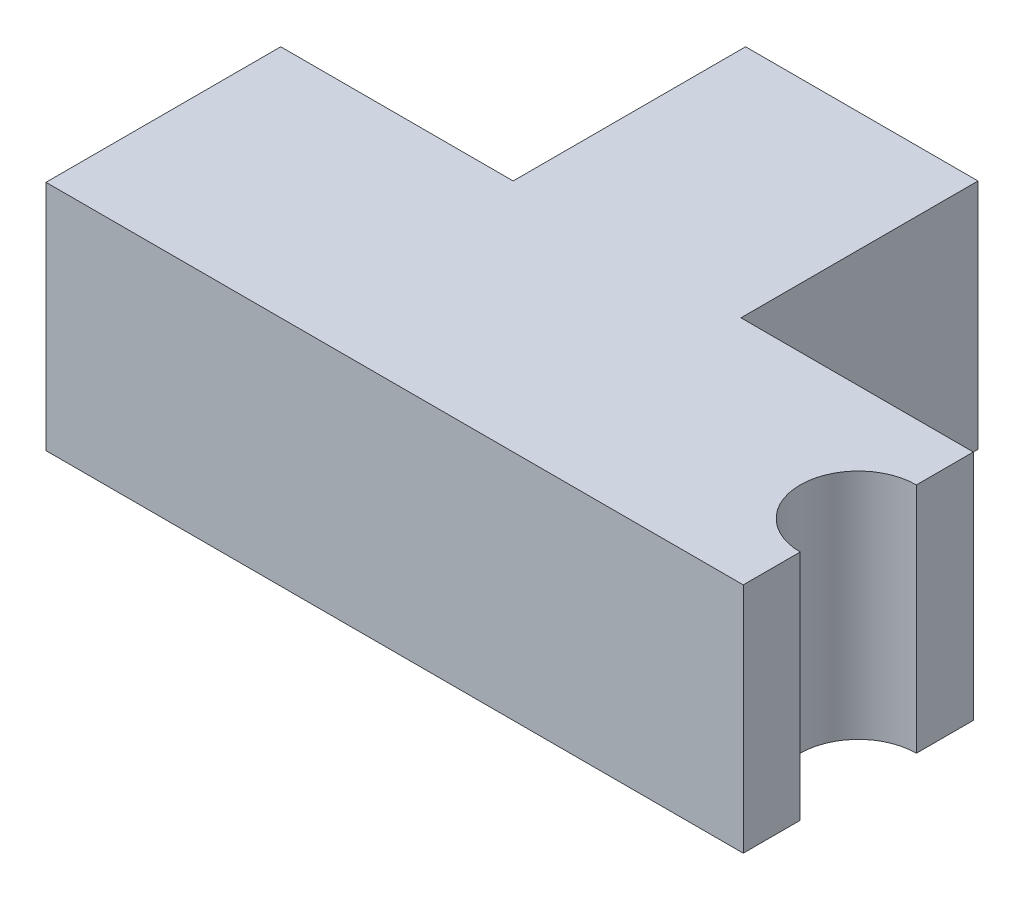
ISO-10303-21;
HEADER;
FILE_DESCRIPTION(('STEP AP214'),'2;1');
FILE_NAME('part.step','',(''),(''),'','','');
FILE_SCHEMA(('AUTOMOTIVE_DESIGN { 1 0 10303 214 1 1 1 1 }'));
ENDSEC;
DATA;
#1=APPLICATION_CONTEXT('core data for automotive mechanical design processes');
#2=APPLICATION_PROTOCOL_DEFINITION('international standard','automotive_design',2000,#1);
#3=PRODUCT_CONTEXT('',#1,'mechanical');
#4=PRODUCT('Part','Part','',(#3));
#5=PRODUCT_RELATED_PRODUCT_CATEGORY('part','',(#4));
#6=PRODUCT_DEFINITION_FORMATION('','',#4);
#7=PRODUCT_DEFINITION_CONTEXT('part definition',#1,'design');
#8=PRODUCT_DEFINITION('design','',#6,#7);
#9=PRODUCT_DEFINITION_SHAPE('','',#8);
#10=(LENGTH_UNIT() NAMED_UNIT(*) SI_UNIT(.MILLI.,.METRE.));
#11=(NAMED_UNIT(*) PLANE_ANGLE_UNIT() SI_UNIT($,.RADIAN.));
#12=(NAMED_UNIT(*) SI_UNIT($,.STERADIAN.) SOLID_ANGLE_UNIT());
#13=UNCERTAINTY_MEASURE_WITH_UNIT(LENGTH_MEASURE(1.E-05),#10,'distance_accuracy_value','');
#14=(GEOMETRIC_REPRESENTATION_CONTEXT(3) GLOBAL_UNCERTAINTY_ASSIGNED_CONTEXT((#13)) GLOBAL_UNIT_ASSIGNED_CONTEXT((#10,
#11,#12)) REPRESENTATION_CONTEXT('',''));
#15=CARTESIAN_POINT('',(0.,0.,0.));
#16=DIRECTION('',(0.,0.,1.));
#17=DIRECTION('',(1.,0.,0.));
#18=AXIS2_PLACEMENT_3D('',#15,#16,#17);
#19=CARTESIAN_POINT('',(14.85,10.,4.9995));
#20=DIRECTION('',(-1.,0.,0.));
#21=DIRECTION('',(0.,0.,1.));
#22=AXIS2_PLACEMENT_3D('',#19,#20,#21);
#23=PLANE('',#22);
#24=DIRECTION('',(0.,0.,-1.));
#25=VECTOR('',#24,1.);
#26=CARTESIAN_POINT('',(14.85,0.,4.9995));
#27=LINE('',#26,#25);
#28=CARTESIAN_POINT('',(14.85,0.,4.9995));
#29=VERTEX_POINT('',#28);
#30=CARTESIAN_POINT('',(14.85,0.,2.5495));
#31=VERTEX_POINT('',#30);
#32=EDGE_CURVE('E141',#29,#31,#27,.T.);
#33=ORIENTED_EDGE('',*,*,#32,.T.);
#34=DIRECTION('',(0.,1.,0.));
#35=VECTOR('',#34,1.);
#36=CARTESIAN_POINT('',(14.85,0.,2.5495));
#37=LINE('',#36,#35);
#38=CARTESIAN_POINT('',(14.85,10.,2.5495));
#39=VERTEX_POINT('',#38);
#40=EDGE_CURVE('E47',#31,#39,#37,.T.);
#41=ORIENTED_EDGE('',*,*,#40,.T.);
#42=DIRECTION('',(0.,0.,-1.));
#43=VECTOR('',#42,1.);
#44=CARTESIAN_POINT('',(14.85,10.,4.9995));
#45=LINE('',#44,#43);
#46=CARTESIAN_POINT('',(14.85,10.,4.9995));
#47=VERTEX_POINT('',#46);
#48=EDGE_CURVE('E200',#47,#39,#45,.T.);
#49=ORIENTED_EDGE('',*,*,#48,.F.);
#50=DIRECTION('',(0.,-1.,0.));
#51=VECTOR('',#50,1.);
#52=CARTESIAN_POINT('',(14.85,10.,4.9995));
#53=LINE('',#52,#51);
#54=EDGE_CURVE('E137',#47,#29,#53,.T.);
#55=ORIENTED_EDGE('',*,*,#54,.T.);
#56=EDGE_LOOP('',(#33,#41,#49,#55));
#57=FACE_BOUND('',#56,.T.);
#58=ADVANCED_FACE('F33',(#57),#23,.F.);
#59=CARTESIAN_POINT('',(14.85,10.,-2.4505));
#60=VERTEX_POINT('',#59);
#61=CARTESIAN_POINT('',(14.85,10.,-4.9005));
#62=VERTEX_POINT('',#61);
#63=EDGE_CURVE('E97',#60,#62,#45,.T.);
#64=ORIENTED_EDGE('',*,*,#63,.F.);
#65=DIRECTION('',(0.,1.,0.));
#66=VECTOR('',#65,1.);
#67=CARTESIAN_POINT('',(14.85,0.,-2.4505));
#68=LINE('',#67,#66);
#69=CARTESIAN_POINT('',(14.85,0.,-2.4505));
#70=VERTEX_POINT('',#69);
#71=EDGE_CURVE('E180',#60,#70,#68,.F.);
#72=ORIENTED_EDGE('',*,*,#71,.T.);
#73=CARTESIAN_POINT('',(14.85,0.,-4.9005));
#74=VERTEX_POINT('',#73);
#75=EDGE_CURVE('E145',#70,#74,#27,.T.);
#76=ORIENTED_EDGE('',*,*,#75,.T.);
#77=DIRECTION('',(0.,-1.,0.));
#78=VECTOR('',#77,1.);
#79=CARTESIAN_POINT('',(14.85,10.,-4.9005));
#80=LINE('',#79,#78);
#81=EDGE_CURVE('E41',#62,#74,#80,.T.);
#82=ORIENTED_EDGE('',*,*,#81,.F.);
#83=EDGE_LOOP('',(#64,#72,#76,#82));
#84=FACE_BOUND('',#83,.T.);
#85=ADVANCED_FACE('F35',(#84),#23,.F.);
#86=CARTESIAN_POINT('',(4.85,10.,-4.9005));
#87=DIRECTION('',(0.,0.,1.));
#88=DIRECTION('',(1.,0.,0.));
#89=AXIS2_PLACEMENT_3D('',#86,#87,#88);
#90=PLANE('',#89);
#91=DIRECTION('',(-1.,0.,0.));
#92=VECTOR('',#91,1.);
#93=CARTESIAN_POINT('',(4.85,0.,-4.9005));
#94=LINE('',#93,#92);
#95=CARTESIAN_POINT('',(4.85,0.,-4.9005));
#96=VERTEX_POINT('',#95);
#97=EDGE_CURVE('E144',#74,#96,#94,.T.);
#98=ORIENTED_EDGE('',*,*,#97,.T.);
#99=DIRECTION('',(0.,-1.,0.));
#100=VECTOR('',#99,1.);
#101=CARTESIAN_POINT('',(4.85,10.,-4.9005));
#102=LINE('',#101,#100);
#103=CARTESIAN_POINT('',(4.85,10.,-4.9005));
#104=VERTEX_POINT('',#103);
#105=EDGE_CURVE('E166',#104,#96,#102,.T.);
#106=ORIENTED_EDGE('',*,*,#105,.F.);
#107=DIRECTION('',(-1.,0.,0.));
#108=VECTOR('',#107,1.);
#109=CARTESIAN_POINT('',(4.85,10.,-4.9005));
#110=LINE('',#109,#108);
#111=EDGE_CURVE('E174',#62,#104,#110,.T.);
#112=ORIENTED_EDGE('',*,*,#111,.F.);
#113=ORIENTED_EDGE('',*,*,#81,.T.);
#114=EDGE_LOOP('',(#98,#106,#112,#113));
#115=FACE_BOUND('',#114,.T.);
#116=ADVANCED_FACE('F171',(#115),#90,.F.);
#117=CARTESIAN_POINT('',(4.85,10.,-15.1005));
#118=DIRECTION('',(-1.,0.,0.));
#119=DIRECTION('',(0.,0.,1.));
#120=AXIS2_PLACEMENT_3D('',#117,#118,#119);
#121=PLANE('',#120);
#122=DIRECTION('',(0.,0.,-1.));
#123=VECTOR('',#122,1.);
#124=CARTESIAN_POINT('',(4.85,0.,-15.1005));
#125=LINE('',#124,#123);
#126=CARTESIAN_POINT('',(4.85,0.,-15.1005));
#127=VERTEX_POINT('',#126);
#128=EDGE_CURVE('E147',#96,#127,#125,.T.);
#129=ORIENTED_EDGE('',*,*,#128,.T.);
#130=DIRECTION('',(0.,-1.,0.));
#131=VECTOR('',#130,1.);
#132=CARTESIAN_POINT('',(4.85,10.,-15.1005));
#133=LINE('',#132,#131);
#134=CARTESIAN_POINT('',(4.85,10.,-15.1005));
#135=VERTEX_POINT('',#134);
#136=EDGE_CURVE('E163',#135,#127,#133,.T.);
#137=ORIENTED_EDGE('',*,*,#136,.F.);
#138=DIRECTION('',(0.,0.,-1.));
#139=VECTOR('',#138,1.);
#140=CARTESIAN_POINT('',(4.85,10.,-15.1005));
#141=LINE('',#140,#139);
#142=EDGE_CURVE('E195',#104,#135,#141,.T.);
#143=ORIENTED_EDGE('',*,*,#142,.F.);
#144=ORIENTED_EDGE('',*,*,#105,.T.);
#145=EDGE_LOOP('',(#129,#137,#143,#144));
#146=FACE_BOUND('',#145,.T.);
#147=ADVANCED_FACE('F188',(#146),#121,.F.);
#148=CARTESIAN_POINT('',(-5.15,10.,-15.1005));
#149=DIRECTION('',(0.,0.,1.));
#150=DIRECTION('',(1.,0.,0.));
#151=AXIS2_PLACEMENT_3D('',#148,#149,#150);
#152=PLANE('',#151);
#153=DIRECTION('',(-1.,0.,0.));
#154=VECTOR('',#153,1.);
#155=CARTESIAN_POINT('',(-5.15,0.,-15.1005));
#156=LINE('',#155,#154);
#157=CARTESIAN_POINT('',(-5.15,0.,-15.1005));
#158=VERTEX_POINT('',#157);
#159=EDGE_CURVE('E149',#127,#158,#156,.T.);
#160=ORIENTED_EDGE('',*,*,#159,.T.);
#161=DIRECTION('',(0.,-1.,0.));
#162=VECTOR('',#161,1.);
#163=CARTESIAN_POINT('',(-5.15,10.,-15.1005));
#164=LINE('',#163,#162);
#165=CARTESIAN_POINT('',(-5.15,10.,-15.1005));
#166=VERTEX_POINT('',#165);
#167=EDGE_CURVE('E160',#166,#158,#164,.T.);
#168=ORIENTED_EDGE('',*,*,#167,.F.);
#169=DIRECTION('',(-1.,0.,0.));
#170=VECTOR('',#169,1.);
#171=CARTESIAN_POINT('',(-5.15,10.,-15.1005));
#172=LINE('',#171,#170);
#173=EDGE_CURVE('E194',#135,#166,#172,.T.);
#174=ORIENTED_EDGE('',*,*,#173,.F.);
#175=ORIENTED_EDGE('',*,*,#136,.T.);
#176=EDGE_LOOP('',(#160,#168,#174,#175));
#177=FACE_BOUND('',#176,.T.);
#178=ADVANCED_FACE('F192',(#177),#152,.F.);
#179=CARTESIAN_POINT('',(-5.15,10.,-15.1005));
#180=DIRECTION('',(1.,0.,0.));
#181=DIRECTION('',(0.,0.,-1.));
#182=AXIS2_PLACEMENT_3D('',#179,#180,#181);
#183=PLANE('',#182);
#184=DIRECTION('',(0.,0.,1.));
#185=VECTOR('',#184,1.);
#186=CARTESIAN_POINT('',(-5.15,0.,-15.1005));
#187=LINE('',#186,#185);
#188=CARTESIAN_POINT('',(-5.15,0.,-5.1005));
#189=VERTEX_POINT('',#188);
#190=EDGE_CURVE('E151',#158,#189,#187,.T.);
#191=ORIENTED_EDGE('',*,*,#190,.T.);
#192=DIRECTION('',(0.,-1.,0.));
#193=VECTOR('',#192,1.);
#194=CARTESIAN_POINT('',(-5.15,10.,-5.1005));
#195=LINE('',#194,#193);
#196=CARTESIAN_POINT('',(-5.15,10.,-5.1005));
#197=VERTEX_POINT('',#196);
#198=EDGE_CURVE('E132',#197,#189,#195,.T.);
#199=ORIENTED_EDGE('',*,*,#198,.F.);
#200=DIRECTION('',(0.,0.,1.));
#201=VECTOR('',#200,1.);
#202=CARTESIAN_POINT('',(-5.15,10.,-15.1005));
#203=LINE('',#202,#201);
#204=EDGE_CURVE('E120',#166,#197,#203,.T.);
#205=ORIENTED_EDGE('',*,*,#204,.F.);
#206=ORIENTED_EDGE('',*,*,#167,.T.);
#207=EDGE_LOOP('',(#191,#199,#205,#206));
#208=FACE_BOUND('',#207,.T.);
#209=ADVANCED_FACE('F235',(#208),#183,.F.);
#210=CARTESIAN_POINT('',(-15.15,10.,-5.1005));
#211=DIRECTION('',(0.,0.,1.));
#212=DIRECTION('',(1.,0.,0.));
#213=AXIS2_PLACEMENT_3D('',#210,#211,#212);
#214=PLANE('',#213);
#215=DIRECTION('',(-1.,0.,0.));
#216=VECTOR('',#215,1.);
#217=CARTESIAN_POINT('',(-15.15,0.,-5.1005));
#218=LINE('',#217,#216);
#219=CARTESIAN_POINT('',(-15.15,0.,-5.1005));
#220=VERTEX_POINT('',#219);
#221=EDGE_CURVE('E129',#189,#220,#218,.T.);
#222=ORIENTED_EDGE('',*,*,#221,.T.);
#223=DIRECTION('',(0.,-1.,0.));
#224=VECTOR('',#223,1.);
#225=CARTESIAN_POINT('',(-15.15,10.,-5.1005));
#226=LINE('',#225,#224);
#227=CARTESIAN_POINT('',(-15.15,10.,-5.1005));
#228=VERTEX_POINT('',#227);
#229=EDGE_CURVE('E126',#228,#220,#226,.T.);
#230=ORIENTED_EDGE('',*,*,#229,.F.);
#231=DIRECTION('',(-1.,0.,0.));
#232=VECTOR('',#231,1.);
#233=CARTESIAN_POINT('',(-15.15,10.,-5.1005));
#234=LINE('',#233,#232);
#235=EDGE_CURVE('E113',#197,#228,#234,.T.);
#236=ORIENTED_EDGE('',*,*,#235,.F.);
#237=ORIENTED_EDGE('',*,*,#198,.T.);
#238=EDGE_LOOP('',(#222,#230,#236,#237));
#239=FACE_BOUND('',#238,.T.);
#240=ADVANCED_FACE('F127',(#239),#214,.F.);
#241=CARTESIAN_POINT('',(-15.15,10.,4.9995));
#242=DIRECTION('',(1.,0.,0.));
#243=DIRECTION('',(0.,0.,-1.));
#244=AXIS2_PLACEMENT_3D('',#241,#242,#243);
#245=PLANE('',#244);
#246=DIRECTION('',(0.,0.,1.));
#247=VECTOR('',#246,1.);
#248=CARTESIAN_POINT('',(-15.15,0.,4.9995));
#249=LINE('',#248,#247);
#250=CARTESIAN_POINT('',(-15.15,0.,4.9995));
#251=VERTEX_POINT('',#250);
#252=EDGE_CURVE('E154',#220,#251,#249,.T.);
#253=ORIENTED_EDGE('',*,*,#252,.T.);
#254=DIRECTION('',(0.,-1.,0.));
#255=VECTOR('',#254,1.);
#256=CARTESIAN_POINT('',(-15.15,10.,4.9995));
#257=LINE('',#256,#255);
#258=CARTESIAN_POINT('',(-15.15,10.,4.9995));
#259=VERTEX_POINT('',#258);
#260=EDGE_CURVE('E133',#259,#251,#257,.T.);
#261=ORIENTED_EDGE('',*,*,#260,.F.);
#262=DIRECTION('',(0.,0.,1.));
#263=VECTOR('',#262,1.);
#264=CARTESIAN_POINT('',(-15.15,10.,4.9995));
#265=LINE('',#264,#263);
#266=EDGE_CURVE('E117',#228,#259,#265,.T.);
#267=ORIENTED_EDGE('',*,*,#266,.F.);
#268=ORIENTED_EDGE('',*,*,#229,.T.);
#269=EDGE_LOOP('',(#253,#261,#267,#268));
#270=FACE_BOUND('',#269,.T.);
#271=ADVANCED_FACE('F135',(#270),#245,.F.);
#272=CARTESIAN_POINT('',(-15.15,10.,4.9995));
#273=DIRECTION('',(0.,0.,-1.));
#274=DIRECTION('',(-1.,0.,0.));
#275=AXIS2_PLACEMENT_3D('',#272,#273,#274);
#276=PLANE('',#275);
#277=DIRECTION('',(1.,0.,0.));
#278=VECTOR('',#277,1.);
#279=CARTESIAN_POINT('',(-15.15,0.,4.9995));
#280=LINE('',#279,#278);
#281=EDGE_CURVE('E89',#251,#29,#280,.T.);
#282=ORIENTED_EDGE('',*,*,#281,.T.);
#283=ORIENTED_EDGE('',*,*,#54,.F.);
#284=DIRECTION('',(1.,0.,0.));
#285=VECTOR('',#284,1.);
#286=CARTESIAN_POINT('',(-15.15,10.,4.9995));
#287=LINE('',#286,#285);
#288=EDGE_CURVE('E56',#259,#47,#287,.T.);
#289=ORIENTED_EDGE('',*,*,#288,.F.);
#290=ORIENTED_EDGE('',*,*,#260,.T.);
#291=EDGE_LOOP('',(#282,#283,#289,#290));
#292=FACE_BOUND('',#291,.T.);
#293=ADVANCED_FACE('F211',(#292),#276,.F.);
#294=CARTESIAN_POINT('',(0.,10.,0.));
#295=DIRECTION('',(0.,-1.,0.));
#296=DIRECTION('',(0.,0.,-1.));
#297=AXIS2_PLACEMENT_3D('',#294,#295,#296);
#298=PLANE('',#297);
#299=ORIENTED_EDGE('',*,*,#48,.T.);
#300=CARTESIAN_POINT('',(14.85,10.,0.0495000000000018));
#301=DIRECTION('',(0.,1.,0.));
#302=DIRECTION('',(0.,0.,1.));
#303=AXIS2_PLACEMENT_3D('',#300,#301,#302);
#304=CIRCLE('',#303,2.5);
#305=EDGE_CURVE('E204',#60,#39,#304,.T.);
#306=ORIENTED_EDGE('',*,*,#305,.F.);
#307=ORIENTED_EDGE('',*,*,#63,.T.);
#308=ORIENTED_EDGE('',*,*,#111,.T.);
#309=ORIENTED_EDGE('',*,*,#142,.T.);
#310=ORIENTED_EDGE('',*,*,#173,.T.);
#311=ORIENTED_EDGE('',*,*,#204,.T.);
#312=ORIENTED_EDGE('',*,*,#235,.T.);
#313=ORIENTED_EDGE('',*,*,#266,.T.);
#314=ORIENTED_EDGE('',*,*,#288,.T.);
#315=EDGE_LOOP('',(#299,#306,#307,#308,#309,#310,#311,#312,#313,#314));
#316=FACE_BOUND('',#315,.T.);
#317=ADVANCED_FACE('F115',(#316),#298,.F.);
#318=CARTESIAN_POINT('',(0.,0.,0.));
#319=DIRECTION('',(0.,-1.,0.));
#320=DIRECTION('',(0.,0.,-1.));
#321=AXIS2_PLACEMENT_3D('',#318,#319,#320);
#322=PLANE('',#321);
#323=CARTESIAN_POINT('',(14.85,0.,0.0495000000000018));
#324=DIRECTION('',(0.,-1.,0.));
#325=DIRECTION('',(0.,0.,-1.));
#326=AXIS2_PLACEMENT_3D('',#323,#324,#325);
#327=CIRCLE('',#326,2.5);
#328=EDGE_CURVE('E11',#31,#70,#327,.T.);
#329=ORIENTED_EDGE('',*,*,#328,.F.);
#330=ORIENTED_EDGE('',*,*,#32,.F.);
#331=ORIENTED_EDGE('',*,*,#281,.F.);
#332=ORIENTED_EDGE('',*,*,#252,.F.);
#333=ORIENTED_EDGE('',*,*,#221,.F.);
#334=ORIENTED_EDGE('',*,*,#190,.F.);
#335=ORIENTED_EDGE('',*,*,#159,.F.);
#336=ORIENTED_EDGE('',*,*,#128,.F.);
#337=ORIENTED_EDGE('',*,*,#97,.F.);
#338=ORIENTED_EDGE('',*,*,#75,.F.);
#339=EDGE_LOOP('',(#329,#330,#331,#332,#333,#334,#335,#336,#337,#338));
#340=FACE_BOUND('',#339,.T.);
#341=ADVANCED_FACE('F183',(#340),#322,.T.);
#342=CARTESIAN_POINT('',(14.85,0.,0.0495000000000018));
#343=DIRECTION('',(0.,1.,0.));
#344=DIRECTION('',(0.,0.,1.));
#345=AXIS2_PLACEMENT_3D('',#342,#343,#344);
#346=CYLINDRICAL_SURFACE('',#345,2.5);
#347=ORIENTED_EDGE('',*,*,#328,.T.);
#348=ORIENTED_EDGE('',*,*,#71,.F.);
#349=ORIENTED_EDGE('',*,*,#305,.T.);
#350=ORIENTED_EDGE('',*,*,#40,.F.);
#351=EDGE_LOOP('',(#347,#348,#349,#350));
#352=FACE_BOUND('',#351,.T.);
#353=ADVANCED_FACE('F206',(#352),#346,.F.);
#354=CLOSED_SHELL('',(#58,#85,#116,#147,#178,#209,#240,#271,#293,#317,#341,#353));
#355=MANIFOLD_SOLID_BREP('B2',#354);
#356=ADVANCED_BREP_SHAPE_REPRESENTATION('',(#18,#355),#14);
#357=SHAPE_DEFINITION_REPRESENTATION(#9,#356);
ENDSEC;
END-ISO-10303-21;
